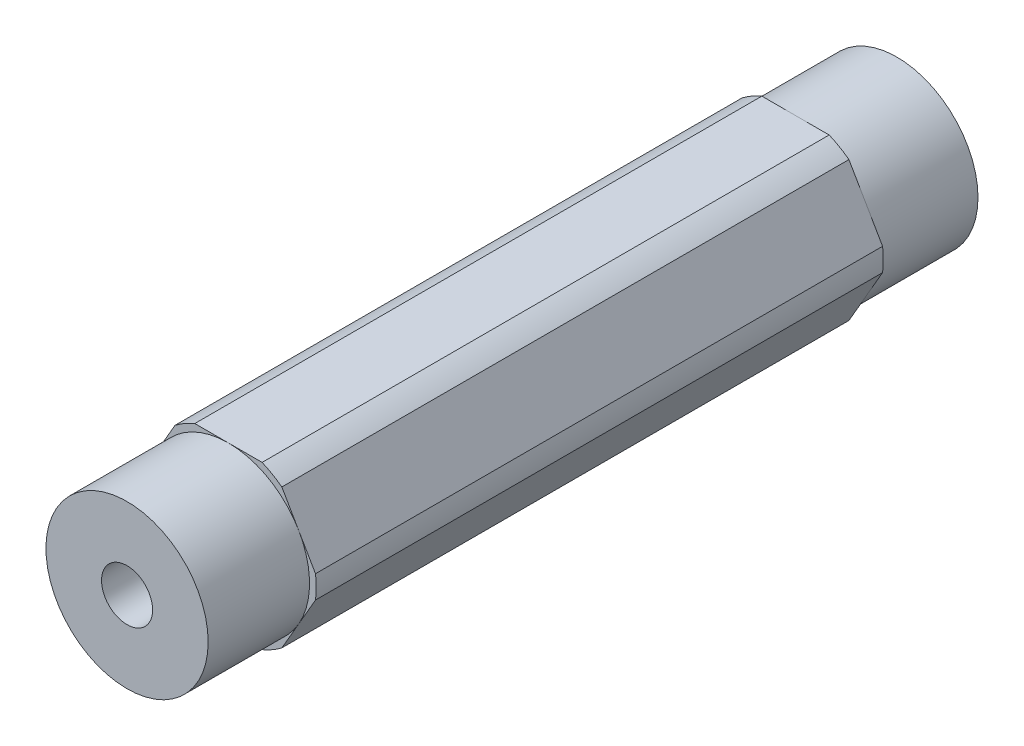
ISO-10303-21;
HEADER;
FILE_DESCRIPTION(('STEP AP214'),'2;1');
FILE_NAME('part.step','',(''),(''),'','','');
FILE_SCHEMA(('AUTOMOTIVE_DESIGN { 1 0 10303 214 1 1 1 1 }'));
ENDSEC;
DATA;
#1=APPLICATION_CONTEXT('core data for automotive mechanical design processes');
#2=APPLICATION_PROTOCOL_DEFINITION('international standard','automotive_design',2000,#1);
#3=PRODUCT_CONTEXT('',#1,'mechanical');
#4=PRODUCT('Part','Part','',(#3));
#5=PRODUCT_RELATED_PRODUCT_CATEGORY('part','',(#4));
#6=PRODUCT_DEFINITION_FORMATION('','',#4);
#7=PRODUCT_DEFINITION_CONTEXT('part definition',#1,'design');
#8=PRODUCT_DEFINITION('design','',#6,#7);
#9=PRODUCT_DEFINITION_SHAPE('','',#8);
#10=(LENGTH_UNIT() NAMED_UNIT(*) SI_UNIT(.MILLI.,.METRE.));
#11=(NAMED_UNIT(*) PLANE_ANGLE_UNIT() SI_UNIT($,.RADIAN.));
#12=(NAMED_UNIT(*) SI_UNIT($,.STERADIAN.) SOLID_ANGLE_UNIT());
#13=UNCERTAINTY_MEASURE_WITH_UNIT(LENGTH_MEASURE(1.E-05),#10,'distance_accuracy_value','');
#14=(GEOMETRIC_REPRESENTATION_CONTEXT(3) GLOBAL_UNCERTAINTY_ASSIGNED_CONTEXT((#13)) GLOBAL_UNIT_ASSIGNED_CONTEXT((#10,
#11,#12)) REPRESENTATION_CONTEXT('',''));
#15=CARTESIAN_POINT('',(0.,0.,0.));
#16=DIRECTION('',(0.,0.,1.));
#17=DIRECTION('',(1.,0.,0.));
#18=AXIS2_PLACEMENT_3D('',#15,#16,#17);
#19=CARTESIAN_POINT('',(0.,0.,-22.1996));
#20=DIRECTION('',(0.,0.,1.));
#21=DIRECTION('',(1.,0.,0.));
#22=AXIS2_PLACEMENT_3D('',#19,#20,#21);
#23=PLANE('',#22);
#24=DIRECTION('',(-0.5,0.866025403784439,0.));
#25=VECTOR('',#24,1.);
#26=CARTESIAN_POINT('',(5.49926131403118,3.175,-22.1996));
#27=LINE('',#26,#25);
#28=CARTESIAN_POINT('',(5.49926131403118,3.175,-22.1996));
#29=VERTEX_POINT('',#28);
#30=CARTESIAN_POINT('',(4.18177084608654,5.45696042896782,-22.1996));
#31=VERTEX_POINT('',#30);
#32=EDGE_CURVE('E175',#29,#31,#27,.T.);
#33=ORIENTED_EDGE('',*,*,#32,.F.);
#34=CARTESIAN_POINT('',(0.,0.,-22.1996));
#35=DIRECTION('',(0.,0.,1.));
#36=DIRECTION('',(1.,0.,0.));
#37=AXIS2_PLACEMENT_3D('',#34,#35,#36);
#38=CIRCLE('',#37,6.35);
#39=CARTESIAN_POINT('',(0.,6.35,-22.1996));
#40=VERTEX_POINT('',#39);
#41=EDGE_CURVE('E50',#29,#40,#38,.T.);
#42=ORIENTED_EDGE('',*,*,#41,.T.);
#43=DIRECTION('',(-1.,0.,0.));
#44=VECTOR('',#43,1.);
#45=CARTESIAN_POINT('',(0.,6.35,-22.1996));
#46=LINE('',#45,#44);
#47=CARTESIAN_POINT('',(2.63498093588929,6.35,-22.1996));
#48=VERTEX_POINT('',#47);
#49=EDGE_CURVE('E174',#48,#40,#46,.T.);
#50=ORIENTED_EDGE('',*,*,#49,.F.);
#51=CARTESIAN_POINT('',(0.,0.,-22.1996));
#52=DIRECTION('',(0.,0.,1.));
#53=DIRECTION('',(1.,0.,0.));
#54=AXIS2_PLACEMENT_3D('',#51,#52,#53);
#55=CIRCLE('',#54,6.874999966);
#56=EDGE_CURVE('E187',#31,#48,#55,.T.);
#57=ORIENTED_EDGE('',*,*,#56,.F.);
#58=EDGE_LOOP('',(#33,#42,#50,#57));
#59=FACE_BOUND('',#58,.T.);
#60=ADVANCED_FACE('F39',(#59),#23,.F.);
#61=CARTESIAN_POINT('',(-2.63498093588929,6.35,-22.1996));
#62=VERTEX_POINT('',#61);
#63=EDGE_CURVE('E181',#40,#62,#46,.T.);
#64=ORIENTED_EDGE('',*,*,#63,.F.);
#65=CARTESIAN_POINT('',(-5.49926131403118,3.175,-22.1996));
#66=VERTEX_POINT('',#65);
#67=EDGE_CURVE('E11',#40,#66,#38,.T.);
#68=ORIENTED_EDGE('',*,*,#67,.T.);
#69=DIRECTION('',(-0.5,-0.866025403784438,0.));
#70=VECTOR('',#69,1.);
#71=CARTESIAN_POINT('',(-5.49926131403118,3.175,-22.1996));
#72=LINE('',#71,#70);
#73=CARTESIAN_POINT('',(-4.18177084608654,5.45696042896783,-22.1996));
#74=VERTEX_POINT('',#73);
#75=EDGE_CURVE('E199',#74,#66,#72,.T.);
#76=ORIENTED_EDGE('',*,*,#75,.F.);
#77=EDGE_CURVE('E183',#62,#74,#55,.T.);
#78=ORIENTED_EDGE('',*,*,#77,.F.);
#79=EDGE_LOOP('',(#64,#68,#76,#78));
#80=FACE_BOUND('',#79,.T.);
#81=ADVANCED_FACE('F182',(#80),#23,.F.);
#82=CARTESIAN_POINT('',(-6.81675178197583,0.893039571032178,-22.1996));
#83=VERTEX_POINT('',#82);
#84=EDGE_CURVE('E194',#66,#83,#72,.T.);
#85=ORIENTED_EDGE('',*,*,#84,.F.);
#86=CARTESIAN_POINT('',(-5.49926131403118,-3.175,-22.1996));
#87=VERTEX_POINT('',#86);
#88=EDGE_CURVE('E48',#66,#87,#38,.T.);
#89=ORIENTED_EDGE('',*,*,#88,.T.);
#90=DIRECTION('',(0.5,-0.866025403784438,0.));
#91=VECTOR('',#90,1.);
#92=CARTESIAN_POINT('',(-5.49926131403118,-3.175,-22.1996));
#93=LINE('',#92,#91);
#94=CARTESIAN_POINT('',(-6.81675178197583,-0.893039571032174,-22.1996));
#95=VERTEX_POINT('',#94);
#96=EDGE_CURVE('E202',#95,#87,#93,.T.);
#97=ORIENTED_EDGE('',*,*,#96,.F.);
#98=EDGE_CURVE('E196',#83,#95,#55,.T.);
#99=ORIENTED_EDGE('',*,*,#98,.F.);
#100=EDGE_LOOP('',(#85,#89,#97,#99));
#101=FACE_BOUND('',#100,.T.);
#102=ADVANCED_FACE('F376',(#101),#23,.F.);
#103=CARTESIAN_POINT('',(-4.18177084608653,-5.45696042896783,-22.1996));
#104=VERTEX_POINT('',#103);
#105=EDGE_CURVE('E206',#87,#104,#93,.T.);
#106=ORIENTED_EDGE('',*,*,#105,.F.);
#107=CARTESIAN_POINT('',(0.,-6.35,-22.1996));
#108=VERTEX_POINT('',#107);
#109=EDGE_CURVE('E340',#87,#108,#38,.T.);
#110=ORIENTED_EDGE('',*,*,#109,.T.);
#111=DIRECTION('',(1.,0.,0.));
#112=VECTOR('',#111,1.);
#113=CARTESIAN_POINT('',(0.,-6.35,-22.1996));
#114=LINE('',#113,#112);
#115=CARTESIAN_POINT('',(-2.6349809358893,-6.35,-22.1996));
#116=VERTEX_POINT('',#115);
#117=EDGE_CURVE('E207',#116,#108,#114,.T.);
#118=ORIENTED_EDGE('',*,*,#117,.F.);
#119=EDGE_CURVE('E205',#104,#116,#55,.T.);
#120=ORIENTED_EDGE('',*,*,#119,.F.);
#121=EDGE_LOOP('',(#106,#110,#118,#120));
#122=FACE_BOUND('',#121,.T.);
#123=ADVANCED_FACE('F339',(#122),#23,.F.);
#124=CARTESIAN_POINT('',(2.6349809358893,-6.35,-22.1996));
#125=VERTEX_POINT('',#124);
#126=EDGE_CURVE('E211',#108,#125,#114,.T.);
#127=ORIENTED_EDGE('',*,*,#126,.F.);
#128=CARTESIAN_POINT('',(5.49926131403118,-3.175,-22.1996));
#129=VERTEX_POINT('',#128);
#130=EDGE_CURVE('E269',#108,#129,#38,.T.);
#131=ORIENTED_EDGE('',*,*,#130,.T.);
#132=DIRECTION('',(0.5,0.866025403784439,0.));
#133=VECTOR('',#132,1.);
#134=CARTESIAN_POINT('',(5.49926131403119,-3.175,-22.1996));
#135=LINE('',#134,#133);
#136=CARTESIAN_POINT('',(4.18177084608654,-5.45696042896782,-22.1996));
#137=VERTEX_POINT('',#136);
#138=EDGE_CURVE('E212',#137,#129,#135,.T.);
#139=ORIENTED_EDGE('',*,*,#138,.F.);
#140=EDGE_CURVE('E210',#125,#137,#55,.T.);
#141=ORIENTED_EDGE('',*,*,#140,.F.);
#142=EDGE_LOOP('',(#127,#131,#139,#141));
#143=FACE_BOUND('',#142,.T.);
#144=ADVANCED_FACE('F360',(#143),#23,.F.);
#145=CARTESIAN_POINT('',(0.,0.,22.1996));
#146=DIRECTION('',(0.,0.,1.));
#147=DIRECTION('',(1.,0.,0.));
#148=AXIS2_PLACEMENT_3D('',#145,#146,#147);
#149=PLANE('',#148);
#150=CARTESIAN_POINT('',(0.,0.,22.1996));
#151=DIRECTION('',(0.,0.,1.));
#152=DIRECTION('',(1.,0.,0.));
#153=AXIS2_PLACEMENT_3D('',#150,#151,#152);
#154=CIRCLE('',#153,6.35);
#155=CARTESIAN_POINT('',(5.49926131403118,3.175,22.1996));
#156=VERTEX_POINT('',#155);
#157=CARTESIAN_POINT('',(0.,6.35,22.1996));
#158=VERTEX_POINT('',#157);
#159=EDGE_CURVE('E252',#156,#158,#154,.T.);
#160=ORIENTED_EDGE('',*,*,#159,.F.);
#161=DIRECTION('',(-0.5,0.866025403784439,0.));
#162=VECTOR('',#161,1.);
#163=CARTESIAN_POINT('',(5.49926131403118,3.175,22.1996));
#164=LINE('',#163,#162);
#165=CARTESIAN_POINT('',(4.18177084608654,5.45696042896782,22.1996));
#166=VERTEX_POINT('',#165);
#167=EDGE_CURVE('E320',#156,#166,#164,.T.);
#168=ORIENTED_EDGE('',*,*,#167,.T.);
#169=CARTESIAN_POINT('',(0.,0.,22.1996));
#170=DIRECTION('',(0.,0.,1.));
#171=DIRECTION('',(1.,0.,0.));
#172=AXIS2_PLACEMENT_3D('',#169,#170,#171);
#173=CIRCLE('',#172,6.874999966);
#174=CARTESIAN_POINT('',(2.63498093588929,6.35,22.1996));
#175=VERTEX_POINT('',#174);
#176=EDGE_CURVE('E311',#166,#175,#173,.T.);
#177=ORIENTED_EDGE('',*,*,#176,.T.);
#178=DIRECTION('',(-1.,0.,0.));
#179=VECTOR('',#178,1.);
#180=CARTESIAN_POINT('',(0.,6.35,22.1996));
#181=LINE('',#180,#179);
#182=EDGE_CURVE('E314',#175,#158,#181,.T.);
#183=ORIENTED_EDGE('',*,*,#182,.T.);
#184=EDGE_LOOP('',(#160,#168,#177,#183));
#185=FACE_BOUND('',#184,.T.);
#186=ADVANCED_FACE('F357',(#185),#149,.T.);
#187=CARTESIAN_POINT('',(-5.49926131403118,3.175,22.1996));
#188=VERTEX_POINT('',#187);
#189=EDGE_CURVE('E261',#158,#188,#154,.T.);
#190=ORIENTED_EDGE('',*,*,#189,.F.);
#191=CARTESIAN_POINT('',(-2.63498093588929,6.35,22.1996));
#192=VERTEX_POINT('',#191);
#193=EDGE_CURVE('E315',#158,#192,#181,.T.);
#194=ORIENTED_EDGE('',*,*,#193,.T.);
#195=CARTESIAN_POINT('',(-4.18177084608654,5.45696042896783,22.1996));
#196=VERTEX_POINT('',#195);
#197=EDGE_CURVE('E317',#192,#196,#173,.T.);
#198=ORIENTED_EDGE('',*,*,#197,.T.);
#199=DIRECTION('',(-0.5,-0.866025403784438,0.));
#200=VECTOR('',#199,1.);
#201=CARTESIAN_POINT('',(-5.49926131403118,3.175,22.1996));
#202=LINE('',#201,#200);
#203=EDGE_CURVE('E299',#196,#188,#202,.T.);
#204=ORIENTED_EDGE('',*,*,#203,.T.);
#205=EDGE_LOOP('',(#190,#194,#198,#204));
#206=FACE_BOUND('',#205,.T.);
#207=ADVANCED_FACE('F359',(#206),#149,.T.);
#208=CARTESIAN_POINT('',(-5.49926131403118,-3.175,22.1996));
#209=VERTEX_POINT('',#208);
#210=EDGE_CURVE('E267',#188,#209,#154,.T.);
#211=ORIENTED_EDGE('',*,*,#210,.F.);
#212=CARTESIAN_POINT('',(-6.81675178197583,0.893039571032178,22.1996));
#213=VERTEX_POINT('',#212);
#214=EDGE_CURVE('E318',#188,#213,#202,.T.);
#215=ORIENTED_EDGE('',*,*,#214,.T.);
#216=CARTESIAN_POINT('',(-6.81675178197583,-0.893039571032174,22.1996));
#217=VERTEX_POINT('',#216);
#218=EDGE_CURVE('E286',#213,#217,#173,.T.);
#219=ORIENTED_EDGE('',*,*,#218,.T.);
#220=DIRECTION('',(0.5,-0.866025403784438,0.));
#221=VECTOR('',#220,1.);
#222=CARTESIAN_POINT('',(-5.49926131403118,-3.175,22.1996));
#223=LINE('',#222,#221);
#224=EDGE_CURVE('E284',#217,#209,#223,.T.);
#225=ORIENTED_EDGE('',*,*,#224,.T.);
#226=EDGE_LOOP('',(#211,#215,#219,#225));
#227=FACE_BOUND('',#226,.T.);
#228=ADVANCED_FACE('F289',(#227),#149,.T.);
#229=CARTESIAN_POINT('',(0.,-6.35,22.1996));
#230=VERTEX_POINT('',#229);
#231=EDGE_CURVE('E256',#209,#230,#154,.T.);
#232=ORIENTED_EDGE('',*,*,#231,.F.);
#233=CARTESIAN_POINT('',(-4.18177084608653,-5.45696042896783,22.1996));
#234=VERTEX_POINT('',#233);
#235=EDGE_CURVE('E276',#209,#234,#223,.T.);
#236=ORIENTED_EDGE('',*,*,#235,.T.);
#237=CARTESIAN_POINT('',(-2.6349809358893,-6.35,22.1996));
#238=VERTEX_POINT('',#237);
#239=EDGE_CURVE('E293',#234,#238,#173,.T.);
#240=ORIENTED_EDGE('',*,*,#239,.T.);
#241=DIRECTION('',(1.,0.,0.));
#242=VECTOR('',#241,1.);
#243=CARTESIAN_POINT('',(0.,-6.35,22.1996));
#244=LINE('',#243,#242);
#245=EDGE_CURVE('E279',#238,#230,#244,.T.);
#246=ORIENTED_EDGE('',*,*,#245,.T.);
#247=EDGE_LOOP('',(#232,#236,#240,#246));
#248=FACE_BOUND('',#247,.T.);
#249=ADVANCED_FACE('F275',(#248),#149,.T.);
#250=CARTESIAN_POINT('',(5.49926131403119,-3.175,22.1996));
#251=VERTEX_POINT('',#250);
#252=EDGE_CURVE('E250',#230,#251,#154,.T.);
#253=ORIENTED_EDGE('',*,*,#252,.F.);
#254=CARTESIAN_POINT('',(2.6349809358893,-6.35,22.1996));
#255=VERTEX_POINT('',#254);
#256=EDGE_CURVE('E294',#230,#255,#244,.T.);
#257=ORIENTED_EDGE('',*,*,#256,.T.);
#258=CARTESIAN_POINT('',(4.18177084608654,-5.45696042896782,22.1996));
#259=VERTEX_POINT('',#258);
#260=EDGE_CURVE('E296',#255,#259,#173,.T.);
#261=ORIENTED_EDGE('',*,*,#260,.T.);
#262=DIRECTION('',(0.5,0.866025403784439,0.));
#263=VECTOR('',#262,1.);
#264=CARTESIAN_POINT('',(5.49926131403119,-3.175,22.1996));
#265=LINE('',#264,#263);
#266=EDGE_CURVE('E302',#259,#251,#265,.T.);
#267=ORIENTED_EDGE('',*,*,#266,.T.);
#268=EDGE_LOOP('',(#253,#257,#261,#267));
#269=FACE_BOUND('',#268,.T.);
#270=ADVANCED_FACE('F348',(#269),#149,.T.);
#271=CARTESIAN_POINT('',(5.49926131403118,3.175,22.1996));
#272=DIRECTION('',(-0.866025403784439,-0.5,0.));
#273=DIRECTION('',(0.5,-0.866025403784439,0.));
#274=AXIS2_PLACEMENT_3D('',#271,#272,#273);
#275=PLANE('',#274);
#276=CARTESIAN_POINT('',(6.81675178197583,0.89303957103218,-22.1996));
#277=VERTEX_POINT('',#276);
#278=EDGE_CURVE('E305',#277,#29,#27,.T.);
#279=ORIENTED_EDGE('',*,*,#278,.T.);
#280=ORIENTED_EDGE('',*,*,#32,.T.);
#281=DIRECTION('',(0.,0.,-1.));
#282=VECTOR('',#281,1.);
#283=CARTESIAN_POINT('',(4.18177084608654,5.45696042896782,22.1996));
#284=LINE('',#283,#282);
#285=EDGE_CURVE('E43',#166,#31,#284,.T.);
#286=ORIENTED_EDGE('',*,*,#285,.F.);
#287=ORIENTED_EDGE('',*,*,#167,.F.);
#288=CARTESIAN_POINT('',(6.81675178197583,0.89303957103218,22.1996));
#289=VERTEX_POINT('',#288);
#290=EDGE_CURVE('E319',#289,#156,#164,.T.);
#291=ORIENTED_EDGE('',*,*,#290,.F.);
#292=DIRECTION('',(0.,0.,-1.));
#293=VECTOR('',#292,1.);
#294=CARTESIAN_POINT('',(6.81675178197583,0.89303957103218,22.1996));
#295=LINE('',#294,#293);
#296=EDGE_CURVE('E217',#289,#277,#295,.T.);
#297=ORIENTED_EDGE('',*,*,#296,.T.);
#298=EDGE_LOOP('',(#279,#280,#286,#287,#291,#297));
#299=FACE_BOUND('',#298,.T.);
#300=ADVANCED_FACE('F308',(#299),#275,.F.);
#301=CARTESIAN_POINT('',(0.,0.,22.1996));
#302=DIRECTION('',(0.,0.,-1.));
#303=DIRECTION('',(-1.,0.,0.));
#304=AXIS2_PLACEMENT_3D('',#301,#302,#303);
#305=CYLINDRICAL_SURFACE('',#304,6.874999966);
#306=ORIENTED_EDGE('',*,*,#56,.T.);
#307=DIRECTION('',(0.,0.,-1.));
#308=VECTOR('',#307,1.);
#309=CARTESIAN_POINT('',(2.63498093588929,6.35,22.1996));
#310=LINE('',#309,#308);
#311=EDGE_CURVE('E193',#175,#48,#310,.T.);
#312=ORIENTED_EDGE('',*,*,#311,.F.);
#313=ORIENTED_EDGE('',*,*,#176,.F.);
#314=ORIENTED_EDGE('',*,*,#285,.T.);
#315=EDGE_LOOP('',(#306,#312,#313,#314));
#316=FACE_BOUND('',#315,.T.);
#317=ADVANCED_FACE('F310',(#316),#305,.T.);
#318=CARTESIAN_POINT('',(0.,6.35,22.1996));
#319=DIRECTION('',(0.,-1.,0.));
#320=DIRECTION('',(0.,0.,-1.));
#321=AXIS2_PLACEMENT_3D('',#318,#319,#320);
#322=PLANE('',#321);
#323=ORIENTED_EDGE('',*,*,#49,.T.);
#324=ORIENTED_EDGE('',*,*,#63,.T.);
#325=DIRECTION('',(0.,0.,-1.));
#326=VECTOR('',#325,1.);
#327=CARTESIAN_POINT('',(-2.63498093588929,6.35,22.1996));
#328=LINE('',#327,#326);
#329=EDGE_CURVE('E245',#192,#62,#328,.T.);
#330=ORIENTED_EDGE('',*,*,#329,.F.);
#331=ORIENTED_EDGE('',*,*,#193,.F.);
#332=ORIENTED_EDGE('',*,*,#182,.F.);
#333=ORIENTED_EDGE('',*,*,#311,.T.);
#334=EDGE_LOOP('',(#323,#324,#330,#331,#332,#333));
#335=FACE_BOUND('',#334,.T.);
#336=ADVANCED_FACE('F190',(#335),#322,.F.);
#337=ORIENTED_EDGE('',*,*,#77,.T.);
#338=DIRECTION('',(0.,0.,-1.));
#339=VECTOR('',#338,1.);
#340=CARTESIAN_POINT('',(-4.18177084608654,5.45696042896783,22.1996));
#341=LINE('',#340,#339);
#342=EDGE_CURVE('E242',#196,#74,#341,.T.);
#343=ORIENTED_EDGE('',*,*,#342,.F.);
#344=ORIENTED_EDGE('',*,*,#197,.F.);
#345=ORIENTED_EDGE('',*,*,#329,.T.);
#346=EDGE_LOOP('',(#337,#343,#344,#345));
#347=FACE_BOUND('',#346,.T.);
#348=ADVANCED_FACE('F419',(#347),#305,.T.);
#349=CARTESIAN_POINT('',(-5.49926131403118,3.175,22.1996));
#350=DIRECTION('',(0.866025403784438,-0.5,0.));
#351=DIRECTION('',(0.5,0.866025403784438,0.));
#352=AXIS2_PLACEMENT_3D('',#349,#350,#351);
#353=PLANE('',#352);
#354=ORIENTED_EDGE('',*,*,#75,.T.);
#355=ORIENTED_EDGE('',*,*,#84,.T.);
#356=DIRECTION('',(0.,0.,-1.));
#357=VECTOR('',#356,1.);
#358=CARTESIAN_POINT('',(-6.81675178197583,0.893039571032178,22.1996));
#359=LINE('',#358,#357);
#360=EDGE_CURVE('E239',#213,#83,#359,.T.);
#361=ORIENTED_EDGE('',*,*,#360,.F.);
#362=ORIENTED_EDGE('',*,*,#214,.F.);
#363=ORIENTED_EDGE('',*,*,#203,.F.);
#364=ORIENTED_EDGE('',*,*,#342,.T.);
#365=EDGE_LOOP('',(#354,#355,#361,#362,#363,#364));
#366=FACE_BOUND('',#365,.T.);
#367=ADVANCED_FACE('F416',(#366),#353,.F.);
#368=ORIENTED_EDGE('',*,*,#98,.T.);
#369=DIRECTION('',(0.,0.,-1.));
#370=VECTOR('',#369,1.);
#371=CARTESIAN_POINT('',(-6.81675178197583,-0.893039571032174,22.1996));
#372=LINE('',#371,#370);
#373=EDGE_CURVE('E236',#217,#95,#372,.T.);
#374=ORIENTED_EDGE('',*,*,#373,.F.);
#375=ORIENTED_EDGE('',*,*,#218,.F.);
#376=ORIENTED_EDGE('',*,*,#360,.T.);
#377=EDGE_LOOP('',(#368,#374,#375,#376));
#378=FACE_BOUND('',#377,.T.);
#379=ADVANCED_FACE('F415',(#378),#305,.T.);
#380=CARTESIAN_POINT('',(-5.49926131403118,-3.175,22.1996));
#381=DIRECTION('',(0.866025403784438,0.5,0.));
#382=DIRECTION('',(-0.5,0.866025403784438,0.));
#383=AXIS2_PLACEMENT_3D('',#380,#381,#382);
#384=PLANE('',#383);
#385=ORIENTED_EDGE('',*,*,#96,.T.);
#386=ORIENTED_EDGE('',*,*,#105,.T.);
#387=DIRECTION('',(0.,0.,-1.));
#388=VECTOR('',#387,1.);
#389=CARTESIAN_POINT('',(-4.18177084608653,-5.45696042896783,22.1996));
#390=LINE('',#389,#388);
#391=EDGE_CURVE('E233',#234,#104,#390,.T.);
#392=ORIENTED_EDGE('',*,*,#391,.F.);
#393=ORIENTED_EDGE('',*,*,#235,.F.);
#394=ORIENTED_EDGE('',*,*,#224,.F.);
#395=ORIENTED_EDGE('',*,*,#373,.T.);
#396=EDGE_LOOP('',(#385,#386,#392,#393,#394,#395));
#397=FACE_BOUND('',#396,.T.);
#398=ADVANCED_FACE('F283',(#397),#384,.F.);
#399=ORIENTED_EDGE('',*,*,#119,.T.);
#400=DIRECTION('',(0.,0.,-1.));
#401=VECTOR('',#400,1.);
#402=CARTESIAN_POINT('',(-2.6349809358893,-6.35,22.1996));
#403=LINE('',#402,#401);
#404=EDGE_CURVE('E230',#238,#116,#403,.T.);
#405=ORIENTED_EDGE('',*,*,#404,.F.);
#406=ORIENTED_EDGE('',*,*,#239,.F.);
#407=ORIENTED_EDGE('',*,*,#391,.T.);
#408=EDGE_LOOP('',(#399,#405,#406,#407));
#409=FACE_BOUND('',#408,.T.);
#410=ADVANCED_FACE('F337',(#409),#305,.T.);
#411=CARTESIAN_POINT('',(0.,-6.35,22.1996));
#412=DIRECTION('',(0.,1.,0.));
#413=DIRECTION('',(0.,0.,1.));
#414=AXIS2_PLACEMENT_3D('',#411,#412,#413);
#415=PLANE('',#414);
#416=ORIENTED_EDGE('',*,*,#117,.T.);
#417=ORIENTED_EDGE('',*,*,#126,.T.);
#418=DIRECTION('',(0.,0.,-1.));
#419=VECTOR('',#418,1.);
#420=CARTESIAN_POINT('',(2.6349809358893,-6.35,22.1996));
#421=LINE('',#420,#419);
#422=EDGE_CURVE('E227',#255,#125,#421,.T.);
#423=ORIENTED_EDGE('',*,*,#422,.F.);
#424=ORIENTED_EDGE('',*,*,#256,.F.);
#425=ORIENTED_EDGE('',*,*,#245,.F.);
#426=ORIENTED_EDGE('',*,*,#404,.T.);
#427=EDGE_LOOP('',(#416,#417,#423,#424,#425,#426));
#428=FACE_BOUND('',#427,.T.);
#429=ADVANCED_FACE('F343',(#428),#415,.F.);
#430=ORIENTED_EDGE('',*,*,#140,.T.);
#431=DIRECTION('',(0.,0.,-1.));
#432=VECTOR('',#431,1.);
#433=CARTESIAN_POINT('',(4.18177084608654,-5.45696042896782,22.1996));
#434=LINE('',#433,#432);
#435=EDGE_CURVE('E224',#259,#137,#434,.T.);
#436=ORIENTED_EDGE('',*,*,#435,.F.);
#437=ORIENTED_EDGE('',*,*,#260,.F.);
#438=ORIENTED_EDGE('',*,*,#422,.T.);
#439=EDGE_LOOP('',(#430,#436,#437,#438));
#440=FACE_BOUND('',#439,.T.);
#441=ADVANCED_FACE('F403',(#440),#305,.T.);
#442=CARTESIAN_POINT('',(5.49926131403119,-3.175,22.1996));
#443=DIRECTION('',(-0.866025403784439,0.5,0.));
#444=DIRECTION('',(-0.5,-0.866025403784439,0.));
#445=AXIS2_PLACEMENT_3D('',#442,#443,#444);
#446=PLANE('',#445);
#447=ORIENTED_EDGE('',*,*,#138,.T.);
#448=CARTESIAN_POINT('',(6.81675178197583,-0.893039571032182,-22.1996));
#449=VERTEX_POINT('',#448);
#450=EDGE_CURVE('E216',#129,#449,#135,.T.);
#451=ORIENTED_EDGE('',*,*,#450,.T.);
#452=DIRECTION('',(0.,0.,-1.));
#453=VECTOR('',#452,1.);
#454=CARTESIAN_POINT('',(6.81675178197583,-0.893039571032182,22.1996));
#455=LINE('',#454,#453);
#456=CARTESIAN_POINT('',(6.81675178197583,-0.893039571032182,22.1996));
#457=VERTEX_POINT('',#456);
#458=EDGE_CURVE('E220',#457,#449,#455,.T.);
#459=ORIENTED_EDGE('',*,*,#458,.F.);
#460=EDGE_CURVE('E304',#251,#457,#265,.T.);
#461=ORIENTED_EDGE('',*,*,#460,.F.);
#462=ORIENTED_EDGE('',*,*,#266,.F.);
#463=ORIENTED_EDGE('',*,*,#435,.T.);
#464=EDGE_LOOP('',(#447,#451,#459,#461,#462,#463));
#465=FACE_BOUND('',#464,.T.);
#466=ADVANCED_FACE('F351',(#465),#446,.F.);
#467=CARTESIAN_POINT('',(0.,0.,22.1996));
#468=DIRECTION('',(0.,0.,-1.));
#469=DIRECTION('',(-1.,0.,0.));
#470=AXIS2_PLACEMENT_3D('',#467,#468,#469);
#471=CYLINDRICAL_SURFACE('',#470,2.000000064);
#472=CARTESIAN_POINT('',(0.,0.,30.1371));
#473=DIRECTION('',(0.,0.,1.));
#474=DIRECTION('',(1.,0.,0.));
#475=AXIS2_PLACEMENT_3D('',#472,#473,#474);
#476=CIRCLE('',#475,2.000000064);
#477=CARTESIAN_POINT('',(2.000000064,0.,30.1371));
#478=VERTEX_POINT('',#477);
#479=EDGE_CURVE('E260',#478,#478,#476,.T.);
#480=ORIENTED_EDGE('',*,*,#479,.T.);
#481=EDGE_LOOP('',(#480));
#482=FACE_BOUND('',#481,.T.);
#483=CARTESIAN_POINT('',(0.,0.,-30.1371));
#484=DIRECTION('',(0.,0.,1.));
#485=DIRECTION('',(1.,0.,0.));
#486=AXIS2_PLACEMENT_3D('',#483,#484,#485);
#487=CIRCLE('',#486,2.000000064);
#488=CARTESIAN_POINT('',(2.000000064,0.,-30.1371));
#489=VERTEX_POINT('',#488);
#490=EDGE_CURVE('E178',#489,#489,#487,.T.);
#491=ORIENTED_EDGE('',*,*,#490,.F.);
#492=EDGE_LOOP('',(#491));
#493=FACE_BOUND('',#492,.T.);
#494=ADVANCED_FACE('F41',(#482,#493),#471,.F.);
#495=EDGE_CURVE('E215',#449,#277,#55,.T.);
#496=ORIENTED_EDGE('',*,*,#495,.T.);
#497=ORIENTED_EDGE('',*,*,#296,.F.);
#498=EDGE_CURVE('E221',#457,#289,#173,.T.);
#499=ORIENTED_EDGE('',*,*,#498,.F.);
#500=ORIENTED_EDGE('',*,*,#458,.T.);
#501=EDGE_LOOP('',(#496,#497,#499,#500));
#502=FACE_BOUND('',#501,.T.);
#503=ADVANCED_FACE('F356',(#502),#305,.T.);
#504=EDGE_CURVE('E64',#251,#156,#154,.T.);
#505=ORIENTED_EDGE('',*,*,#504,.F.);
#506=ORIENTED_EDGE('',*,*,#460,.T.);
#507=ORIENTED_EDGE('',*,*,#498,.T.);
#508=ORIENTED_EDGE('',*,*,#290,.T.);
#509=EDGE_LOOP('',(#505,#506,#507,#508));
#510=FACE_BOUND('',#509,.T.);
#511=ADVANCED_FACE('F355',(#510),#149,.T.);
#512=ORIENTED_EDGE('',*,*,#450,.F.);
#513=EDGE_CURVE('E179',#129,#29,#38,.T.);
#514=ORIENTED_EDGE('',*,*,#513,.T.);
#515=ORIENTED_EDGE('',*,*,#278,.F.);
#516=ORIENTED_EDGE('',*,*,#495,.F.);
#517=EDGE_LOOP('',(#512,#514,#515,#516));
#518=FACE_BOUND('',#517,.T.);
#519=ADVANCED_FACE('F369',(#518),#23,.F.);
#520=CARTESIAN_POINT('',(0.,0.,30.1371));
#521=DIRECTION('',(0.,0.,1.));
#522=DIRECTION('',(1.,0.,0.));
#523=AXIS2_PLACEMENT_3D('',#520,#521,#522);
#524=PLANE('',#523);
#525=CARTESIAN_POINT('',(0.,0.,30.1371));
#526=DIRECTION('',(0.,0.,1.));
#527=DIRECTION('',(1.,0.,0.));
#528=AXIS2_PLACEMENT_3D('',#525,#526,#527);
#529=CIRCLE('',#528,6.35);
#530=CARTESIAN_POINT('',(6.35,0.,30.1371));
#531=VERTEX_POINT('',#530);
#532=EDGE_CURVE('E259',#531,#531,#529,.T.);
#533=ORIENTED_EDGE('',*,*,#532,.T.);
#534=EDGE_LOOP('',(#533));
#535=FACE_BOUND('',#534,.T.);
#536=ORIENTED_EDGE('',*,*,#479,.F.);
#537=EDGE_LOOP('',(#536));
#538=FACE_BOUND('',#537,.T.);
#539=ADVANCED_FACE('F379',(#535,#538),#524,.T.);
#540=CARTESIAN_POINT('',(0.,0.,30.1371));
#541=DIRECTION('',(0.,0.,-1.));
#542=DIRECTION('',(-1.,0.,0.));
#543=AXIS2_PLACEMENT_3D('',#540,#541,#542);
#544=CYLINDRICAL_SURFACE('',#543,6.35);
#545=ORIENTED_EDGE('',*,*,#532,.F.);
#546=EDGE_LOOP('',(#545));
#547=FACE_BOUND('',#546,.T.);
#548=ORIENTED_EDGE('',*,*,#159,.T.);
#549=ORIENTED_EDGE('',*,*,#189,.T.);
#550=ORIENTED_EDGE('',*,*,#210,.T.);
#551=ORIENTED_EDGE('',*,*,#231,.T.);
#552=ORIENTED_EDGE('',*,*,#252,.T.);
#553=ORIENTED_EDGE('',*,*,#504,.T.);
#554=EDGE_LOOP('',(#548,#549,#550,#551,#552,#553));
#555=FACE_BOUND('',#554,.T.);
#556=ADVANCED_FACE('F271',(#547,#555),#544,.T.);
#557=CARTESIAN_POINT('',(0.,0.,-30.1371));
#558=DIRECTION('',(0.,0.,1.));
#559=DIRECTION('',(1.,0.,0.));
#560=AXIS2_PLACEMENT_3D('',#557,#558,#559);
#561=CYLINDRICAL_SURFACE('',#560,6.35);
#562=CARTESIAN_POINT('',(0.,0.,-30.1371));
#563=DIRECTION('',(0.,0.,1.));
#564=DIRECTION('',(1.,0.,0.));
#565=AXIS2_PLACEMENT_3D('',#562,#563,#564);
#566=CIRCLE('',#565,6.35);
#567=CARTESIAN_POINT('',(6.35,0.,-30.1371));
#568=VERTEX_POINT('',#567);
#569=EDGE_CURVE('E177',#568,#568,#566,.T.);
#570=ORIENTED_EDGE('',*,*,#569,.T.);
#571=EDGE_LOOP('',(#570));
#572=FACE_BOUND('',#571,.T.);
#573=ORIENTED_EDGE('',*,*,#41,.F.);
#574=ORIENTED_EDGE('',*,*,#513,.F.);
#575=ORIENTED_EDGE('',*,*,#130,.F.);
#576=ORIENTED_EDGE('',*,*,#109,.F.);
#577=ORIENTED_EDGE('',*,*,#88,.F.);
#578=ORIENTED_EDGE('',*,*,#67,.F.);
#579=EDGE_LOOP('',(#573,#574,#575,#576,#577,#578));
#580=FACE_BOUND('',#579,.T.);
#581=ADVANCED_FACE('F163',(#572,#580),#561,.T.);
#582=CARTESIAN_POINT('',(0.,0.,-30.1371));
#583=DIRECTION('',(0.,0.,-1.));
#584=DIRECTION('',(1.,0.,0.));
#585=AXIS2_PLACEMENT_3D('',#582,#583,#584);
#586=PLANE('',#585);
#587=ORIENTED_EDGE('',*,*,#490,.T.);
#588=EDGE_LOOP('',(#587));
#589=FACE_BOUND('',#588,.T.);
#590=ORIENTED_EDGE('',*,*,#569,.F.);
#591=EDGE_LOOP('',(#590));
#592=FACE_BOUND('',#591,.T.);
#593=ADVANCED_FACE('F394',(#589,#592),#586,.T.);
#594=CLOSED_SHELL('',(#60,#81,#102,#123,#144,#186,#207,#228,#249,#270,#300,#317,#336,#348,#367,
#379,#398,#410,#429,#441,#466,#494,#503,#511,#519,#539,#556,#581,#593));
#595=MANIFOLD_SOLID_BREP('B2',#594);
#596=ADVANCED_BREP_SHAPE_REPRESENTATION('',(#18,#595),#14);
#597=SHAPE_DEFINITION_REPRESENTATION(#9,#596);
ENDSEC;
END-ISO-10303-21;
